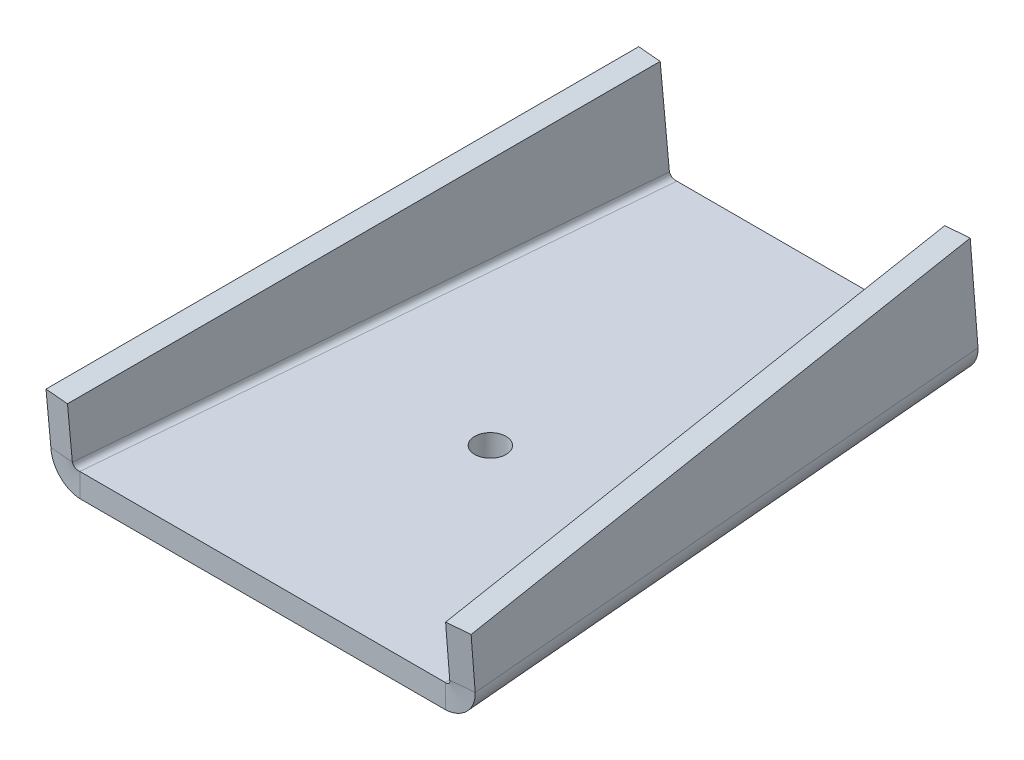
ISO-10303-21;
HEADER;
FILE_DESCRIPTION(('STEP AP214'),'2;1');
FILE_NAME('part.step','',(''),(''),'','','');
FILE_SCHEMA(('AUTOMOTIVE_DESIGN { 1 0 10303 214 1 1 1 1 }'));
ENDSEC;
DATA;
#1=APPLICATION_CONTEXT('core data for automotive mechanical design processes');
#2=APPLICATION_PROTOCOL_DEFINITION('international standard','automotive_design',2000,#1);
#3=PRODUCT_CONTEXT('',#1,'mechanical');
#4=PRODUCT('Part','Part','',(#3));
#5=PRODUCT_RELATED_PRODUCT_CATEGORY('part','',(#4));
#6=PRODUCT_DEFINITION_FORMATION('','',#4);
#7=PRODUCT_DEFINITION_CONTEXT('part definition',#1,'design');
#8=PRODUCT_DEFINITION('design','',#6,#7);
#9=PRODUCT_DEFINITION_SHAPE('','',#8);
#10=(LENGTH_UNIT() NAMED_UNIT(*) SI_UNIT(.MILLI.,.METRE.));
#11=(NAMED_UNIT(*) PLANE_ANGLE_UNIT() SI_UNIT($,.RADIAN.));
#12=(NAMED_UNIT(*) SI_UNIT($,.STERADIAN.) SOLID_ANGLE_UNIT());
#13=UNCERTAINTY_MEASURE_WITH_UNIT(LENGTH_MEASURE(1.E-05),#10,'distance_accuracy_value','');
#14=(GEOMETRIC_REPRESENTATION_CONTEXT(3) GLOBAL_UNCERTAINTY_ASSIGNED_CONTEXT((#13)) GLOBAL_UNIT_ASSIGNED_CONTEXT((#10,
#11,#12)) REPRESENTATION_CONTEXT('',''));
#15=CARTESIAN_POINT('',(0.,0.,0.));
#16=DIRECTION('',(0.,0.,1.));
#17=DIRECTION('',(1.,0.,0.));
#18=AXIS2_PLACEMENT_3D('',#15,#16,#17);
#19=CARTESIAN_POINT('',(0.,0.,0.));
#20=DIRECTION('',(0.,-1.,0.));
#21=DIRECTION('',(0.,0.,-1.));
#22=AXIS2_PLACEMENT_3D('',#19,#20,#21);
#23=PLANE('',#22);
#24=CARTESIAN_POINT('',(0.,0.,5.99999999999999));
#25=DIRECTION('',(0.,1.,0.));
#26=DIRECTION('',(0.,0.,1.));
#27=AXIS2_PLACEMENT_3D('',#24,#25,#26);
#28=CIRCLE('',#27,2.);
#29=CARTESIAN_POINT('',(0.,0.,7.99999999999999));
#30=VERTEX_POINT('',#29);
#31=EDGE_CURVE('E823',#30,#30,#28,.T.);
#32=ORIENTED_EDGE('',*,*,#31,.F.);
#33=EDGE_LOOP('',(#32));
#34=FACE_BOUND('',#33,.T.);
#35=DIRECTION('',(1.,0.,0.));
#36=VECTOR('',#35,1.);
#37=CARTESIAN_POINT('',(-33.,0.,35.));
#38=LINE('',#37,#36);
#39=CARTESIAN_POINT('',(-23.2606990742545,0.,35.));
#40=VERTEX_POINT('',#39);
#41=CARTESIAN_POINT('',(23.2606990742545,0.,35.));
#42=VERTEX_POINT('',#41);
#43=EDGE_CURVE('E94',#40,#42,#38,.T.);
#44=ORIENTED_EDGE('',*,*,#43,.T.);
#45=DIRECTION('',(-0.0854011413464359,0.,-0.996346649041751));
#46=VECTOR('',#45,1.);
#47=CARTESIAN_POINT('',(20.1129306045071,0.,-1.72396548038632));
#48=LINE('',#47,#46);
#49=CARTESIAN_POINT('',(17.2606990742545,0.,-35.));
#50=VERTEX_POINT('',#49);
#51=EDGE_CURVE('E87',#42,#50,#48,.T.);
#52=ORIENTED_EDGE('',*,*,#51,.T.);
#53=DIRECTION('',(-1.,0.,0.));
#54=VECTOR('',#53,1.);
#55=CARTESIAN_POINT('',(-33.,0.,-35.));
#56=LINE('',#55,#54);
#57=CARTESIAN_POINT('',(-17.2606990742545,0.,-35.));
#58=VERTEX_POINT('',#57);
#59=EDGE_CURVE('E102',#50,#58,#56,.T.);
#60=ORIENTED_EDGE('',*,*,#59,.T.);
#61=DIRECTION('',(0.0854011413464358,0.,-0.996346649041751));
#62=VECTOR('',#61,1.);
#63=CARTESIAN_POINT('',(-20.1129306045071,0.,-1.72396548038632));
#64=LINE('',#63,#62);
#65=EDGE_CURVE('E454',#40,#58,#64,.T.);
#66=ORIENTED_EDGE('',*,*,#65,.F.);
#67=EDGE_LOOP('',(#44,#52,#60,#66));
#68=FACE_BOUND('',#67,.T.);
#69=ADVANCED_FACE('F77',(#34,#68),#23,.F.);
#70=CARTESIAN_POINT('',(0.,-3.,0.));
#71=DIRECTION('',(0.,-1.,0.));
#72=DIRECTION('',(0.,0.,-1.));
#73=AXIS2_PLACEMENT_3D('',#70,#71,#72);
#74=PLANE('',#73);
#75=CARTESIAN_POINT('',(0.,-3.,5.99999999999999));
#76=DIRECTION('',(0.,-1.,0.));
#77=DIRECTION('',(0.,0.,-1.));
#78=AXIS2_PLACEMENT_3D('',#75,#76,#77);
#79=CIRCLE('',#78,2.);
#80=CARTESIAN_POINT('',(0.,-3.,3.99999999999999));
#81=VERTEX_POINT('',#80);
#82=EDGE_CURVE('E82',#81,#81,#79,.T.);
#83=ORIENTED_EDGE('',*,*,#82,.F.);
#84=EDGE_LOOP('',(#83));
#85=FACE_BOUND('',#84,.T.);
#86=DIRECTION('',(-0.0854011413464359,0.,-0.996346649041751));
#87=VECTOR('',#86,1.);
#88=CARTESIAN_POINT('',(20.1129306045071,-3.,-1.72396548038632));
#89=LINE('',#88,#87);
#90=CARTESIAN_POINT('',(23.2606990742545,-3.,35.));
#91=VERTEX_POINT('',#90);
#92=CARTESIAN_POINT('',(17.2606990742545,-3.,-35.));
#93=VERTEX_POINT('',#92);
#94=EDGE_CURVE('E890',#91,#93,#89,.T.);
#95=ORIENTED_EDGE('',*,*,#94,.F.);
#96=DIRECTION('',(1.,0.,0.));
#97=VECTOR('',#96,1.);
#98=CARTESIAN_POINT('',(-33.,-3.,35.));
#99=LINE('',#98,#97);
#100=CARTESIAN_POINT('',(-23.2606990742545,-3.,35.));
#101=VERTEX_POINT('',#100);
#102=EDGE_CURVE('E625',#101,#91,#99,.T.);
#103=ORIENTED_EDGE('',*,*,#102,.F.);
#104=DIRECTION('',(0.0854011413464358,0.,-0.996346649041751));
#105=VECTOR('',#104,1.);
#106=CARTESIAN_POINT('',(-20.1129306045071,-3.,-1.72396548038632));
#107=LINE('',#106,#105);
#108=CARTESIAN_POINT('',(-17.2606990742545,-3.,-35.));
#109=VERTEX_POINT('',#108);
#110=EDGE_CURVE('E619',#101,#109,#107,.T.);
#111=ORIENTED_EDGE('',*,*,#110,.T.);
#112=DIRECTION('',(-1.,0.,0.));
#113=VECTOR('',#112,1.);
#114=CARTESIAN_POINT('',(-33.,-3.,-35.));
#115=LINE('',#114,#113);
#116=EDGE_CURVE('E479',#93,#109,#115,.T.);
#117=ORIENTED_EDGE('',*,*,#116,.F.);
#118=EDGE_LOOP('',(#95,#103,#111,#117));
#119=FACE_BOUND('',#118,.T.);
#120=ADVANCED_FACE('F411',(#85,#119),#74,.T.);
#121=CARTESIAN_POINT('',(-33.,-3.,-35.));
#122=DIRECTION('',(0.,0.,-1.));
#123=DIRECTION('',(-1.,0.,0.));
#124=AXIS2_PLACEMENT_3D('',#121,#122,#123);
#125=PLANE('',#124);
#126=CARTESIAN_POINT('',(17.2606990742545,-3.,-35.));
#127=CARTESIAN_POINT('',(17.2606990742545,0.,-35.));
#128=B_SPLINE_CURVE_WITH_KNOTS('',1,(#126,#127),.UNSPECIFIED.,.F.,.F.,(2,2),(0.,1.),.UNSPECIFIED.);
#129=EDGE_CURVE('E308',#93,#50,#128,.T.);
#130=ORIENTED_EDGE('',*,*,#129,.F.);
#131=ORIENTED_EDGE('',*,*,#116,.T.);
#132=CARTESIAN_POINT('',(-17.2606990742545,0.,-35.));
#133=CARTESIAN_POINT('',(-17.2606990742545,-3.,-35.));
#134=B_SPLINE_CURVE_WITH_KNOTS('',1,(#132,#133),.UNSPECIFIED.,.F.,.F.,(2,2),(0.,1.),.UNSPECIFIED.);
#135=EDGE_CURVE('E450',#109,#58,#134,.F.);
#136=ORIENTED_EDGE('',*,*,#135,.T.);
#137=ORIENTED_EDGE('',*,*,#59,.F.);
#138=EDGE_LOOP('',(#130,#131,#136,#137));
#139=FACE_BOUND('',#138,.T.);
#140=ADVANCED_FACE('F528',(#139),#125,.T.);
#141=CARTESIAN_POINT('',(-33.,-3.,35.));
#142=DIRECTION('',(0.,0.,1.));
#143=DIRECTION('',(1.,0.,0.));
#144=AXIS2_PLACEMENT_3D('',#141,#142,#143);
#145=PLANE('',#144);
#146=CARTESIAN_POINT('',(23.2606990742545,0.,35.0000000000001));
#147=CARTESIAN_POINT('',(23.2606990742545,-3.,35.));
#148=B_SPLINE_CURVE_WITH_KNOTS('',1,(#146,#147),.UNSPECIFIED.,.F.,.F.,(2,2),(0.,1.),.UNSPECIFIED.);
#149=EDGE_CURVE('E12',#42,#91,#148,.T.);
#150=ORIENTED_EDGE('',*,*,#149,.F.);
#151=ORIENTED_EDGE('',*,*,#43,.F.);
#152=CARTESIAN_POINT('',(-23.2606990742545,-3.,35.));
#153=CARTESIAN_POINT('',(-23.2606990742545,0.,35.));
#154=B_SPLINE_CURVE_WITH_KNOTS('',1,(#152,#153),.UNSPECIFIED.,.F.,.F.,(2,2),(0.,1.),.UNSPECIFIED.);
#155=EDGE_CURVE('E437',#40,#101,#154,.F.);
#156=ORIENTED_EDGE('',*,*,#155,.T.);
#157=ORIENTED_EDGE('',*,*,#102,.T.);
#158=EDGE_LOOP('',(#150,#151,#156,#157));
#159=FACE_BOUND('',#158,.T.);
#160=ADVANCED_FACE('F79',(#159),#145,.T.);
#161=CARTESIAN_POINT('',(-23.2606990742545,-3.,35.));
#162=CARTESIAN_POINT('',(-23.7499499944457,-3.,34.9795752216678));
#163=CARTESIAN_POINT('',(-24.2388331183929,-2.90274630363883,34.9591742282255));
#164=CARTESIAN_POINT('',(-25.1429668954393,-2.52839021872452,34.9246913364874));
#165=CARTESIAN_POINT('',(-25.5577752247937,-2.25143512330504,34.9106434814043));
#166=CARTESIAN_POINT('',(-26.2506280277805,-1.55971527385827,34.8942703874428));
#167=CARTESIAN_POINT('',(-26.5284013334941,-1.14522268205391,34.8919683915288));
#168=CARTESIAN_POINT('',(-26.9050498131617,-0.241447144696889,34.9026985252804));
#169=CARTESIAN_POINT('',(-27.0037779027792,0.247392185745543,34.9157393919235));
#170=CARTESIAN_POINT('',(-27.005608256553,0.736599999999999,34.9370935192842));
#171=CARTESIAN_POINT('',(-23.2606990742545,0.,35.));
#172=CARTESIAN_POINT('',(-23.3586143746017,0.,35.0131180997183));
#173=CARTESIAN_POINT('',(-23.4564582359675,0.0191717263661178,35.0262349324334));
#174=CARTESIAN_POINT('',(-23.6376296449802,0.0929689463382528,35.0537202436696));
#175=CARTESIAN_POINT('',(-23.7208705294139,0.147565403889501,35.068092455294));
#176=CARTESIAN_POINT('',(-23.8603918914608,0.283924886066478,35.0991477705559));
#177=CARTESIAN_POINT('',(-23.916618913449,0.365634259058795,35.1158354561041));
#178=CARTESIAN_POINT('',(-23.9938065751916,0.543796508380954,35.1522336599635));
#179=CARTESIAN_POINT('',(-24.0147379705513,0.640162719297398,35.1719429897649));
#180=CARTESIAN_POINT('',(-24.0165683094277,0.7366,35.1932969433235));
#181=B_SPLINE_SURFACE_WITH_KNOTS('',1,3,((#161,#162,#163,#164,#165,#166,#167,#168,#169,#170),
(#171,#172,#173,#174,#175,#176,#177,#178,#179,#180)),.UNSPECIFIED.,.F.,.F.,.F.,(2,2),(4,2,2,2,
4),(0.,1.),(0.,0.25,0.5,0.75,1.),.UNSPECIFIED.);
#182=CARTESIAN_POINT('',(-23.2606990742545,0.,35.));
#183=CARTESIAN_POINT('',(-23.3586143746017,0.,35.0131180997183));
#184=CARTESIAN_POINT('',(-23.4564582359675,0.0191717263661178,35.0262349324334));
#185=CARTESIAN_POINT('',(-23.6376296449802,0.0929689463382528,35.0537202436696));
#186=CARTESIAN_POINT('',(-23.7208705294139,0.147565403889501,35.068092455294));
#187=CARTESIAN_POINT('',(-23.8603918914608,0.283924886066478,35.0991477705559));
#188=CARTESIAN_POINT('',(-23.916618913449,0.365634259058795,35.1158354561041));
#189=CARTESIAN_POINT('',(-23.9938065751916,0.543796508380954,35.1522336599635));
#190=CARTESIAN_POINT('',(-24.0147379705513,0.640162719297398,35.1719429897649));
#191=CARTESIAN_POINT('',(-24.0165683094277,0.7366,35.1932969433235));
#192=B_SPLINE_CURVE_WITH_KNOTS('',3,(#182,#183,#184,#185,#186,#187,#188,#189,#190,#191),
.UNSPECIFIED.,.F.,.F.,(4,2,2,2,4),(0.,0.25,0.5,0.75,1.),.UNSPECIFIED.);
#193=CARTESIAN_POINT('',(-24.0165683094277,0.7366,35.1932969433235));
#194=VERTEX_POINT('',#193);
#195=EDGE_CURVE('E320',#40,#194,#192,.T.);
#196=CARTESIAN_POINT('',(-24.0165683094277,0.7366,35.1932969433235));
#197=CARTESIAN_POINT('',(-27.005608256553,0.736599999999999,34.9370935192842));
#198=B_SPLINE_CURVE_WITH_KNOTS('',1,(#196,#197),.UNSPECIFIED.,.F.,.F.,(2,2),(0.,1.),.UNSPECIFIED.);
#199=CARTESIAN_POINT('',(-27.005608256553,0.736600000000014,34.9370935192842));
#200=VERTEX_POINT('',#199);
#201=EDGE_CURVE('E332',#194,#200,#198,.T.);
#202=CARTESIAN_POINT('',(-27.005608256553,0.736599999999999,34.9370935192842));
#203=CARTESIAN_POINT('',(-27.0037779027792,0.247392185745543,34.9157393919235));
#204=CARTESIAN_POINT('',(-26.9050498131617,-0.241447144696889,34.9026985252804));
#205=CARTESIAN_POINT('',(-26.5284013334941,-1.14522268205391,34.8919683915288));
#206=CARTESIAN_POINT('',(-26.2506280277805,-1.55971527385827,34.8942703874428));
#207=CARTESIAN_POINT('',(-25.5577752247937,-2.25143512330504,34.9106434814043));
#208=CARTESIAN_POINT('',(-25.1429668954393,-2.52839021872452,34.9246913364874));
#209=CARTESIAN_POINT('',(-24.2388331183929,-2.90274630363883,34.9591742282255));
#210=CARTESIAN_POINT('',(-23.7499499944457,-3.,34.9795752216678));
#211=CARTESIAN_POINT('',(-23.2606990742545,-3.,35.));
#212=B_SPLINE_CURVE_WITH_KNOTS('',3,(#202,#203,#204,#205,#206,#207,#208,#209,#210,#211),
.UNSPECIFIED.,.F.,.F.,(4,2,2,2,4),(0.,0.25,0.5,0.75,1.),.UNSPECIFIED.);
#213=EDGE_CURVE('E375',#101,#200,#212,.F.);
#214=ORIENTED_EDGE('',*,*,#155,.F.);
#215=ORIENTED_EDGE('',*,*,#195,.T.);
#216=ORIENTED_EDGE('',*,*,#201,.T.);
#217=ORIENTED_EDGE('',*,*,#213,.F.);
#218=EDGE_LOOP('',(#214,#215,#216,#217));
#219=FACE_BOUND('',#218,.T.);
#220=ADVANCED_FACE('F397',(#219),#181,.T.);
#221=CARTESIAN_POINT('',(-21.005608256553,0.736599999999999,-35.0629064807158));
#222=CARTESIAN_POINT('',(-21.0037779027792,0.247392185745544,-35.0842606080765));
#223=CARTESIAN_POINT('',(-20.9050498131618,-0.241447144696889,-35.0973014747196));
#224=CARTESIAN_POINT('',(-20.5284013334941,-1.14522268205391,-35.1080316084712));
#225=CARTESIAN_POINT('',(-20.2506280277805,-1.55971527385827,-35.1057296125572));
#226=CARTESIAN_POINT('',(-19.5577752247937,-2.25143512330504,-35.0893565185957));
#227=CARTESIAN_POINT('',(-19.1429668954393,-2.52839021872452,-35.0753086635126));
#228=CARTESIAN_POINT('',(-18.2388331183929,-2.90274630363883,-35.0408257717745));
#229=CARTESIAN_POINT('',(-17.7499499944457,-3.,-35.0204247783323));
#230=CARTESIAN_POINT('',(-17.2606990742545,-3.,-35.));
#231=CARTESIAN_POINT('',(-18.0165683094277,0.7366,-34.8067030566765));
#232=CARTESIAN_POINT('',(-18.0147379705513,0.640162719297402,-34.8280570102352));
#233=CARTESIAN_POINT('',(-17.9938065751916,0.543796508380953,-34.8477663400365));
#234=CARTESIAN_POINT('',(-17.916618913449,0.365634259058794,-34.8841645438959));
#235=CARTESIAN_POINT('',(-17.8603918914608,0.283924886066477,-34.9008522294442));
#236=CARTESIAN_POINT('',(-17.7208705294139,0.1475654038895,-34.931907544706));
#237=CARTESIAN_POINT('',(-17.6376296449802,0.0929689463382522,-34.9462797563304));
#238=CARTESIAN_POINT('',(-17.4564582359675,0.0191717263661176,-34.9737650675667));
#239=CARTESIAN_POINT('',(-17.3586143746017,0.,-34.9868819002818));
#240=CARTESIAN_POINT('',(-17.2606990742545,0.,-35.));
#241=B_SPLINE_SURFACE_WITH_KNOTS('',1,3,((#221,#222,#223,#224,#225,#226,#227,#228,#229,#230),
(#231,#232,#233,#234,#235,#236,#237,#238,#239,#240)),.UNSPECIFIED.,.F.,.F.,.F.,(2,2),(4,2,2,2,
4),(0.,1.),(0.,0.25,0.5,0.75,1.),.UNSPECIFIED.);
#242=CARTESIAN_POINT('',(-21.005608256553,0.736599999999999,-35.0629064807158));
#243=CARTESIAN_POINT('',(-18.0165683094277,0.7366,-34.8067030566765));
#244=B_SPLINE_CURVE_WITH_KNOTS('',1,(#242,#243),.UNSPECIFIED.,.F.,.F.,(2,2),(0.,1.),.UNSPECIFIED.);
#245=CARTESIAN_POINT('',(-21.005608256553,0.736600000000018,-35.0629064807158));
#246=VERTEX_POINT('',#245);
#247=CARTESIAN_POINT('',(-18.0165683094277,0.736599999999997,-34.8067030566765));
#248=VERTEX_POINT('',#247);
#249=EDGE_CURVE('E488',#246,#248,#244,.T.);
#250=CARTESIAN_POINT('',(-18.0165683094277,0.7366,-34.8067030566765));
#251=CARTESIAN_POINT('',(-18.0147379705513,0.640162719297402,-34.8280570102352));
#252=CARTESIAN_POINT('',(-17.9938065751916,0.543796508380953,-34.8477663400365));
#253=CARTESIAN_POINT('',(-17.916618913449,0.365634259058794,-34.8841645438959));
#254=CARTESIAN_POINT('',(-17.8603918914608,0.283924886066477,-34.9008522294442));
#255=CARTESIAN_POINT('',(-17.7208705294139,0.1475654038895,-34.931907544706));
#256=CARTESIAN_POINT('',(-17.6376296449802,0.0929689463382522,-34.9462797563304));
#257=CARTESIAN_POINT('',(-17.4564582359675,0.0191717263661176,-34.9737650675667));
#258=CARTESIAN_POINT('',(-17.3586143746017,0.,-34.9868819002818));
#259=CARTESIAN_POINT('',(-17.2606990742545,0.,-35.));
#260=B_SPLINE_CURVE_WITH_KNOTS('',3,(#250,#251,#252,#253,#254,#255,#256,#257,#258,#259),
.UNSPECIFIED.,.F.,.F.,(4,2,2,2,4),(0.,0.25,0.5,0.75,1.),.UNSPECIFIED.);
#261=EDGE_CURVE('E615',#248,#58,#260,.T.);
#262=CARTESIAN_POINT('',(-17.2606990742545,-3.,-35.));
#263=CARTESIAN_POINT('',(-17.7499499944457,-3.,-35.0204247783323));
#264=CARTESIAN_POINT('',(-18.2388331183929,-2.90274630363883,-35.0408257717745));
#265=CARTESIAN_POINT('',(-19.1429668954393,-2.52839021872452,-35.0753086635126));
#266=CARTESIAN_POINT('',(-19.5577752247937,-2.25143512330504,-35.0893565185957));
#267=CARTESIAN_POINT('',(-20.2506280277805,-1.55971527385827,-35.1057296125572));
#268=CARTESIAN_POINT('',(-20.5284013334941,-1.14522268205391,-35.1080316084712));
#269=CARTESIAN_POINT('',(-20.9050498131618,-0.241447144696889,-35.0973014747196));
#270=CARTESIAN_POINT('',(-21.0037779027792,0.247392185745544,-35.0842606080765));
#271=CARTESIAN_POINT('',(-21.005608256553,0.736599999999999,-35.0629064807158));
#272=B_SPLINE_CURVE_WITH_KNOTS('',3,(#262,#263,#264,#265,#266,#267,#268,#269,#270,#271),
.UNSPECIFIED.,.F.,.F.,(4,2,2,2,4),(0.,0.25,0.5,0.75,1.),.UNSPECIFIED.);
#273=EDGE_CURVE('E465',#246,#109,#272,.F.);
#274=ORIENTED_EDGE('',*,*,#249,.T.);
#275=ORIENTED_EDGE('',*,*,#261,.T.);
#276=ORIENTED_EDGE('',*,*,#135,.F.);
#277=ORIENTED_EDGE('',*,*,#273,.F.);
#278=EDGE_LOOP('',(#274,#275,#276,#277));
#279=FACE_BOUND('',#278,.T.);
#280=ADVANCED_FACE('F350',(#279),#241,.T.);
#281=CARTESIAN_POINT('',(-26.2935496579618,0.7366,70.383256809919));
#282=DIRECTION('',(0.0854011413464358,0.,-0.996346649041751));
#283=DIRECTION('',(-0.996346649041751,0.,-0.0854011413464358));
#284=AXIS2_PLACEMENT_3D('',#281,#282,#283);
#285=CYLINDRICAL_SURFACE('',#284,3.7366);
#286=ORIENTED_EDGE('',*,*,#273,.T.);
#287=ORIENTED_EDGE('',*,*,#110,.F.);
#288=ORIENTED_EDGE('',*,*,#213,.T.);
#289=DIRECTION('',(0.0854011413464358,0.,-0.996346649041751));
#290=VECTOR('',#289,1.);
#291=CARTESIAN_POINT('',(-23.8358794933165,0.736600000000007,-2.04307538514142));
#292=LINE('',#291,#290);
#293=EDGE_CURVE('E486',#200,#246,#292,.T.);
#294=ORIENTED_EDGE('',*,*,#293,.T.);
#295=EDGE_LOOP('',(#286,#287,#288,#294));
#296=FACE_BOUND('',#295,.T.);
#297=ADVANCED_FACE('F339',(#296),#285,.T.);
#298=CARTESIAN_POINT('',(-26.2935496579618,0.7366,70.383256809919));
#299=DIRECTION('',(0.0854011413464358,0.,-0.996346649041751));
#300=DIRECTION('',(-0.996346649041751,0.,-0.0854011413464358));
#301=AXIS2_PLACEMENT_3D('',#298,#299,#300);
#302=CYLINDRICAL_SURFACE('',#301,0.7366);
#303=ORIENTED_EDGE('',*,*,#261,.F.);
#304=DIRECTION('',(0.0854011413464358,0.,-0.996346649041751));
#305=VECTOR('',#304,1.);
#306=CARTESIAN_POINT('',(-20.8468395461912,0.736599999999997,-1.78687196110211));
#307=LINE('',#306,#305);
#308=EDGE_CURVE('E504',#194,#248,#307,.T.);
#309=ORIENTED_EDGE('',*,*,#308,.F.);
#310=ORIENTED_EDGE('',*,*,#195,.F.);
#311=ORIENTED_EDGE('',*,*,#65,.T.);
#312=EDGE_LOOP('',(#303,#309,#310,#311));
#313=FACE_BOUND('',#312,.T.);
#314=ADVANCED_FACE('F349',(#313),#302,.F.);
#315=CARTESIAN_POINT('',(-27.0546801416147,7.44031984137577,35.5095988450045));
#316=DIRECTION('',(-0.00729335494327044,0.996346649041751,0.0850891410048625));
#317=DIRECTION('',(-0.0850891410048625,-0.0854011413464358,0.992706645056726));
#318=AXIS2_PLACEMENT_3D('',#315,#316,#317);
#319=PLANE('',#318);
#320=DIRECTION('',(-0.0850891410048625,-0.0854011413464358,0.992706645056726));
#321=VECTOR('',#320,1.);
#322=CARTESIAN_POINT('',(-24.0656401944894,7.44031984137575,35.7658022690438));
#323=LINE('',#322,#321);
#324=CARTESIAN_POINT('',(-18.1094003241491,13.4183997356263,-33.7236628849271));
#325=VERTEX_POINT('',#324);
#326=CARTESIAN_POINT('',(-24.0656401944894,7.44031984137575,35.7658022690438));
#327=VERTEX_POINT('',#326);
#328=EDGE_CURVE('E322',#325,#327,#323,.T.);
#329=ORIENTED_EDGE('',*,*,#328,.F.);
#330=DIRECTION('',(0.996346649041751,0.,0.0854011413464358));
#331=VECTOR('',#330,1.);
#332=CARTESIAN_POINT('',(-21.0984402712743,13.4183997356263,-33.9798663089664));
#333=LINE('',#332,#331);
#334=CARTESIAN_POINT('',(-21.0984402712743,13.4183997356263,-33.9798663089664));
#335=VERTEX_POINT('',#334);
#336=EDGE_CURVE('E312',#335,#325,#333,.T.);
#337=ORIENTED_EDGE('',*,*,#336,.F.);
#338=DIRECTION('',(-0.0850891410048625,-0.0854011413464358,0.992706645056726));
#339=VECTOR('',#338,1.);
#340=CARTESIAN_POINT('',(-27.0546801416147,7.44031984137577,35.5095988450045));
#341=LINE('',#340,#339);
#342=CARTESIAN_POINT('',(-27.0546801416147,7.44031984137577,35.5095988450045));
#343=VERTEX_POINT('',#342);
#344=EDGE_CURVE('E329',#335,#343,#341,.T.);
#345=ORIENTED_EDGE('',*,*,#344,.T.);
#346=DIRECTION('',(0.996346649041751,0.,0.0854011413464358));
#347=VECTOR('',#346,1.);
#348=CARTESIAN_POINT('',(-27.0546801416147,7.44031984137577,35.5095988450045));
#349=LINE('',#348,#347);
#350=EDGE_CURVE('E326',#343,#327,#349,.T.);
#351=ORIENTED_EDGE('',*,*,#350,.T.);
#352=EDGE_LOOP('',(#329,#337,#345,#351));
#353=FACE_BOUND('',#352,.T.);
#354=ADVANCED_FACE('F283',(#353),#319,.T.);
#355=CARTESIAN_POINT('',(-23.8358794933166,-22.4500796298768,-2.04307538514142));
#356=DIRECTION('',(-0.996346649041751,0.,-0.0854011413464358));
#357=DIRECTION('',(0.0850891410048625,0.0854011413464358,-0.992706645056726));
#358=AXIS2_PLACEMENT_3D('',#355,#356,#357);
#359=PLANE('',#358);
#360=ORIENTED_EDGE('',*,*,#293,.F.);
#361=DIRECTION('',(0.00729335494327044,-0.996346649041751,-0.0850891410048625));
#362=VECTOR('',#361,1.);
#363=CARTESIAN_POINT('',(-27.0546801416147,7.44031984137577,35.5095988450045));
#364=LINE('',#363,#362);
#365=EDGE_CURVE('E328',#343,#200,#364,.T.);
#366=ORIENTED_EDGE('',*,*,#365,.F.);
#367=ORIENTED_EDGE('',*,*,#344,.F.);
#368=DIRECTION('',(-0.00729335494327045,0.996346649041751,0.0850891410048626));
#369=VECTOR('',#368,1.);
#370=CARTESIAN_POINT('',(-21.0984402712743,13.4183997356263,-33.9798663089664));
#371=LINE('',#370,#369);
#372=EDGE_CURVE('E321',#246,#335,#371,.T.);
#373=ORIENTED_EDGE('',*,*,#372,.F.);
#374=EDGE_LOOP('',(#360,#366,#367,#373));
#375=FACE_BOUND('',#374,.T.);
#376=ADVANCED_FACE('F515',(#375),#359,.T.);
#377=CARTESIAN_POINT('',(-27.0546801416147,7.44031984137577,35.5095988450045));
#378=DIRECTION('',(-0.0850891410048625,-0.0854011413464358,0.992706645056726));
#379=DIRECTION('',(0.00729335494327044,-0.996346649041751,-0.0850891410048625));
#380=AXIS2_PLACEMENT_3D('',#377,#378,#379);
#381=PLANE('',#380);
#382=ORIENTED_EDGE('',*,*,#201,.F.);
#383=DIRECTION('',(0.00729335494327044,-0.996346649041751,-0.0850891410048625));
#384=VECTOR('',#383,1.);
#385=CARTESIAN_POINT('',(-24.0656401944894,7.44031984137575,35.7658022690438));
#386=LINE('',#385,#384);
#387=EDGE_CURVE('E493',#327,#194,#386,.T.);
#388=ORIENTED_EDGE('',*,*,#387,.F.);
#389=ORIENTED_EDGE('',*,*,#350,.F.);
#390=ORIENTED_EDGE('',*,*,#365,.T.);
#391=EDGE_LOOP('',(#382,#388,#389,#390));
#392=FACE_BOUND('',#391,.T.);
#393=ADVANCED_FACE('F506',(#392),#381,.T.);
#394=CARTESIAN_POINT('',(-20.8468395461913,-22.4500796298768,-1.78687196110212));
#395=DIRECTION('',(-0.996346649041751,0.,-0.0854011413464358));
#396=DIRECTION('',(0.0850891410048625,0.0854011413464358,-0.992706645056726));
#397=AXIS2_PLACEMENT_3D('',#394,#395,#396);
#398=PLANE('',#397);
#399=ORIENTED_EDGE('',*,*,#387,.T.);
#400=ORIENTED_EDGE('',*,*,#308,.T.);
#401=DIRECTION('',(-0.00729335494327045,0.996346649041751,0.0850891410048626));
#402=VECTOR('',#401,1.);
#403=CARTESIAN_POINT('',(-18.1094003241491,13.4183997356263,-33.7236628849271));
#404=LINE('',#403,#402);
#405=EDGE_CURVE('E325',#248,#325,#404,.T.);
#406=ORIENTED_EDGE('',*,*,#405,.T.);
#407=ORIENTED_EDGE('',*,*,#328,.T.);
#408=EDGE_LOOP('',(#399,#400,#406,#407));
#409=FACE_BOUND('',#408,.T.);
#410=ADVANCED_FACE('F514',(#409),#398,.F.);
#411=CARTESIAN_POINT('',(-21.0984402712743,13.4183997356263,-33.9798663089664));
#412=DIRECTION('',(0.0850891410048625,0.0854011413464359,-0.992706645056726));
#413=DIRECTION('',(-0.00729335494327045,0.996346649041751,0.0850891410048626));
#414=AXIS2_PLACEMENT_3D('',#411,#412,#413);
#415=PLANE('',#414);
#416=ORIENTED_EDGE('',*,*,#249,.F.);
#417=ORIENTED_EDGE('',*,*,#372,.T.);
#418=ORIENTED_EDGE('',*,*,#336,.T.);
#419=ORIENTED_EDGE('',*,*,#405,.F.);
#420=EDGE_LOOP('',(#416,#417,#418,#419));
#421=FACE_BOUND('',#420,.T.);
#422=ADVANCED_FACE('F352',(#421),#415,.T.);
#423=CARTESIAN_POINT('',(27.005608256553,0.736599999999999,34.9370935192842));
#424=CARTESIAN_POINT('',(27.0037779027792,0.247392185745544,34.9157393919235));
#425=CARTESIAN_POINT('',(26.9050498131617,-0.241447144696889,34.9026985252804));
#426=CARTESIAN_POINT('',(26.5284013334941,-1.14522268205391,34.8919683915289));
#427=CARTESIAN_POINT('',(26.2506280277805,-1.55971527385827,34.8942703874428));
#428=CARTESIAN_POINT('',(25.5577752247937,-2.25143512330504,34.9106434814043));
#429=CARTESIAN_POINT('',(25.1429668954393,-2.52839021872452,34.9246913364875));
#430=CARTESIAN_POINT('',(24.2388331183929,-2.90274630363883,34.9591742282255));
#431=CARTESIAN_POINT('',(23.7499499944457,-3.,34.9795752216678));
#432=CARTESIAN_POINT('',(23.2606990742545,-3.,35.));
#433=CARTESIAN_POINT('',(24.0165683094277,0.7366,35.1932969433235));
#434=CARTESIAN_POINT('',(24.0147379705513,0.640162719297405,35.1719429897649));
#435=CARTESIAN_POINT('',(23.9938065751917,0.543796508380954,35.1522336599636));
#436=CARTESIAN_POINT('',(23.916618913449,0.365634259058796,35.1158354561042));
#437=CARTESIAN_POINT('',(23.8603918914608,0.283924886066479,35.0991477705559));
#438=CARTESIAN_POINT('',(23.7208705294139,0.147565403889502,35.068092455294));
#439=CARTESIAN_POINT('',(23.6376296449802,0.092968946338254,35.0537202436697));
#440=CARTESIAN_POINT('',(23.4564582359675,0.0191717263661184,35.0262349324334));
#441=CARTESIAN_POINT('',(23.3586143746017,0.,35.0131180997183));
#442=CARTESIAN_POINT('',(23.2606990742545,0.,35.0000000000001));
#443=B_SPLINE_SURFACE_WITH_KNOTS('',1,3,((#423,#424,#425,#426,#427,#428,#429,#430,#431,#432),
(#433,#434,#435,#436,#437,#438,#439,#440,#441,#442)),.UNSPECIFIED.,.F.,.F.,.F.,(2,2),(4,2,2,2,
4),(0.,1.),(0.,0.25,0.5,0.75,1.),.UNSPECIFIED.);
#444=CARTESIAN_POINT('',(27.005608256553,0.736599999999999,34.9370935192842));
#445=CARTESIAN_POINT('',(24.0165683094277,0.7366,35.1932969433235));
#446=B_SPLINE_CURVE_WITH_KNOTS('',1,(#444,#445),.UNSPECIFIED.,.F.,.F.,(2,2),(0.,1.),.UNSPECIFIED.);
#447=CARTESIAN_POINT('',(24.0165683094277,0.736600000000004,35.1932969433235));
#448=VERTEX_POINT('',#447);
#449=CARTESIAN_POINT('',(27.005608256553,0.73659999999999,34.9370935192842));
#450=VERTEX_POINT('',#449);
#451=EDGE_CURVE('E177',#448,#450,#446,.F.);
#452=CARTESIAN_POINT('',(24.0165683094277,0.7366,35.1932969433235));
#453=CARTESIAN_POINT('',(24.0147379705513,0.640162719297405,35.1719429897649));
#454=CARTESIAN_POINT('',(23.9938065751917,0.543796508380954,35.1522336599636));
#455=CARTESIAN_POINT('',(23.916618913449,0.365634259058796,35.1158354561042));
#456=CARTESIAN_POINT('',(23.8603918914608,0.283924886066479,35.0991477705559));
#457=CARTESIAN_POINT('',(23.7208705294139,0.147565403889502,35.068092455294));
#458=CARTESIAN_POINT('',(23.6376296449802,0.092968946338254,35.0537202436697));
#459=CARTESIAN_POINT('',(23.4564582359675,0.0191717263661184,35.0262349324334));
#460=CARTESIAN_POINT('',(23.3586143746017,0.,35.0131180997183));
#461=CARTESIAN_POINT('',(23.2606990742545,0.,35.0000000000001));
#462=B_SPLINE_CURVE_WITH_KNOTS('',3,(#452,#453,#454,#455,#456,#457,#458,#459,#460,#461),
.UNSPECIFIED.,.F.,.F.,(4,2,2,2,4),(0.,0.25,0.5,0.75,1.),.UNSPECIFIED.);
#463=EDGE_CURVE('E189',#448,#42,#462,.T.);
#464=CARTESIAN_POINT('',(23.2606990742545,-3.,35.));
#465=CARTESIAN_POINT('',(23.7499499944457,-3.,34.9795752216678));
#466=CARTESIAN_POINT('',(24.2388331183929,-2.90274630363883,34.9591742282255));
#467=CARTESIAN_POINT('',(25.1429668954393,-2.52839021872452,34.9246913364875));
#468=CARTESIAN_POINT('',(25.5577752247937,-2.25143512330504,34.9106434814043));
#469=CARTESIAN_POINT('',(26.2506280277805,-1.55971527385827,34.8942703874428));
#470=CARTESIAN_POINT('',(26.5284013334941,-1.14522268205391,34.8919683915289));
#471=CARTESIAN_POINT('',(26.9050498131617,-0.241447144696889,34.9026985252804));
#472=CARTESIAN_POINT('',(27.0037779027792,0.247392185745544,34.9157393919235));
#473=CARTESIAN_POINT('',(27.005608256553,0.736599999999999,34.9370935192842));
#474=B_SPLINE_CURVE_WITH_KNOTS('',3,(#464,#465,#466,#467,#468,#469,#470,#471,#472,#473),
.UNSPECIFIED.,.F.,.F.,(4,2,2,2,4),(0.,0.25,0.5,0.75,1.),.UNSPECIFIED.);
#475=EDGE_CURVE('E589',#450,#91,#474,.F.);
#476=ORIENTED_EDGE('',*,*,#451,.F.);
#477=ORIENTED_EDGE('',*,*,#463,.T.);
#478=ORIENTED_EDGE('',*,*,#149,.T.);
#479=ORIENTED_EDGE('',*,*,#475,.F.);
#480=EDGE_LOOP('',(#476,#477,#478,#479));
#481=FACE_BOUND('',#480,.T.);
#482=ADVANCED_FACE('F279',(#481),#443,.T.);
#483=CARTESIAN_POINT('',(17.2606990742545,-3.,-35.));
#484=CARTESIAN_POINT('',(17.7499499944457,-3.,-35.0204247783322));
#485=CARTESIAN_POINT('',(18.2388331183929,-2.90274630363883,-35.0408257717745));
#486=CARTESIAN_POINT('',(19.1429668954393,-2.52839021872452,-35.0753086635126));
#487=CARTESIAN_POINT('',(19.5577752247937,-2.25143512330504,-35.0893565185957));
#488=CARTESIAN_POINT('',(20.2506280277805,-1.55971527385827,-35.1057296125572));
#489=CARTESIAN_POINT('',(20.5284013334941,-1.14522268205391,-35.1080316084711));
#490=CARTESIAN_POINT('',(20.9050498131617,-0.241447144696889,-35.0973014747196));
#491=CARTESIAN_POINT('',(21.0037779027792,0.247392185745545,-35.0842606080765));
#492=CARTESIAN_POINT('',(21.005608256553,0.736599999999999,-35.0629064807158));
#493=CARTESIAN_POINT('',(17.2606990742545,0.,-35.));
#494=CARTESIAN_POINT('',(17.3586143746017,0.,-34.9868819002817));
#495=CARTESIAN_POINT('',(17.4564582359675,0.0191717263661181,-34.9737650675666));
#496=CARTESIAN_POINT('',(17.6376296449802,0.0929689463382534,-34.9462797563303));
#497=CARTESIAN_POINT('',(17.7208705294139,0.147565403889501,-34.931907544706));
#498=CARTESIAN_POINT('',(17.8603918914608,0.283924886066479,-34.9008522294441));
#499=CARTESIAN_POINT('',(17.916618913449,0.365634259058795,-34.8841645438958));
#500=CARTESIAN_POINT('',(17.9938065751916,0.543796508380954,-34.8477663400364));
#501=CARTESIAN_POINT('',(18.0147379705513,0.640162719297398,-34.8280570102351));
#502=CARTESIAN_POINT('',(18.0165683094277,0.7366,-34.8067030566765));
#503=B_SPLINE_SURFACE_WITH_KNOTS('',1,3,((#483,#484,#485,#486,#487,#488,#489,#490,#491,#492),
(#493,#494,#495,#496,#497,#498,#499,#500,#501,#502)),.UNSPECIFIED.,.F.,.F.,.F.,(2,2),(4,2,2,2,
4),(0.,1.),(0.,0.25,0.5,0.75,1.),.UNSPECIFIED.);
#504=CARTESIAN_POINT('',(17.2606990742545,0.,-35.));
#505=CARTESIAN_POINT('',(17.3586143746017,0.,-34.9868819002817));
#506=CARTESIAN_POINT('',(17.4564582359675,0.0191717263661181,-34.9737650675666));
#507=CARTESIAN_POINT('',(17.6376296449802,0.0929689463382534,-34.9462797563303));
#508=CARTESIAN_POINT('',(17.7208705294139,0.147565403889501,-34.931907544706));
#509=CARTESIAN_POINT('',(17.8603918914608,0.283924886066479,-34.9008522294441));
#510=CARTESIAN_POINT('',(17.916618913449,0.365634259058795,-34.8841645438958));
#511=CARTESIAN_POINT('',(17.9938065751916,0.543796508380954,-34.8477663400364));
#512=CARTESIAN_POINT('',(18.0147379705513,0.640162719297398,-34.8280570102351));
#513=CARTESIAN_POINT('',(18.0165683094277,0.7366,-34.8067030566765));
#514=B_SPLINE_CURVE_WITH_KNOTS('',3,(#504,#505,#506,#507,#508,#509,#510,#511,#512,#513),
.UNSPECIFIED.,.F.,.F.,(4,2,2,2,4),(0.,0.25,0.5,0.75,1.),.UNSPECIFIED.);
#515=CARTESIAN_POINT('',(18.0165683094277,0.736600000000014,-34.8067030566765));
#516=VERTEX_POINT('',#515);
#517=EDGE_CURVE('E251',#50,#516,#514,.T.);
#518=CARTESIAN_POINT('',(18.0165683094277,0.7366,-34.8067030566765));
#519=CARTESIAN_POINT('',(21.005608256553,0.736599999999999,-35.0629064807158));
#520=B_SPLINE_CURVE_WITH_KNOTS('',1,(#518,#519),.UNSPECIFIED.,.F.,.F.,(2,2),(0.,1.),.UNSPECIFIED.);
#521=CARTESIAN_POINT('',(21.005608256553,0.736600000000025,-35.0629064807158));
#522=VERTEX_POINT('',#521);
#523=EDGE_CURVE('E554',#522,#516,#520,.F.);
#524=CARTESIAN_POINT('',(21.005608256553,0.736599999999999,-35.0629064807158));
#525=CARTESIAN_POINT('',(21.0037779027792,0.247392185745545,-35.0842606080765));
#526=CARTESIAN_POINT('',(20.9050498131617,-0.241447144696889,-35.0973014747196));
#527=CARTESIAN_POINT('',(20.5284013334941,-1.14522268205391,-35.1080316084711));
#528=CARTESIAN_POINT('',(20.2506280277805,-1.55971527385827,-35.1057296125572));
#529=CARTESIAN_POINT('',(19.5577752247937,-2.25143512330504,-35.0893565185957));
#530=CARTESIAN_POINT('',(19.1429668954393,-2.52839021872452,-35.0753086635126));
#531=CARTESIAN_POINT('',(18.2388331183929,-2.90274630363883,-35.0408257717745));
#532=CARTESIAN_POINT('',(17.7499499944457,-3.,-35.0204247783322));
#533=CARTESIAN_POINT('',(17.2606990742545,-3.,-35.));
#534=B_SPLINE_CURVE_WITH_KNOTS('',3,(#524,#525,#526,#527,#528,#529,#530,#531,#532,#533),
.UNSPECIFIED.,.F.,.F.,(4,2,2,2,4),(0.,0.25,0.5,0.75,1.),.UNSPECIFIED.);
#535=EDGE_CURVE('E245',#93,#522,#534,.F.);
#536=ORIENTED_EDGE('',*,*,#517,.T.);
#537=ORIENTED_EDGE('',*,*,#523,.F.);
#538=ORIENTED_EDGE('',*,*,#535,.F.);
#539=ORIENTED_EDGE('',*,*,#129,.T.);
#540=EDGE_LOOP('',(#536,#537,#538,#539));
#541=FACE_BOUND('',#540,.T.);
#542=ADVANCED_FACE('F221',(#541),#503,.T.);
#543=CARTESIAN_POINT('',(14.2278484905471,0.7366,-70.383256809919));
#544=DIRECTION('',(0.0854011413464359,0.,0.996346649041751));
#545=DIRECTION('',(0.996346649041751,0.,-0.0854011413464359));
#546=AXIS2_PLACEMENT_3D('',#543,#544,#545);
#547=CYLINDRICAL_SURFACE('',#546,3.7366);
#548=ORIENTED_EDGE('',*,*,#94,.T.);
#549=ORIENTED_EDGE('',*,*,#535,.T.);
#550=DIRECTION('',(-0.0854011413464359,0.,-0.996346649041751));
#551=VECTOR('',#550,1.);
#552=CARTESIAN_POINT('',(23.8358794933165,0.736600000000018,-2.04307538514142));
#553=LINE('',#552,#551);
#554=EDGE_CURVE('E198',#450,#522,#553,.T.);
#555=ORIENTED_EDGE('',*,*,#554,.F.);
#556=ORIENTED_EDGE('',*,*,#475,.T.);
#557=EDGE_LOOP('',(#548,#549,#555,#556));
#558=FACE_BOUND('',#557,.T.);
#559=ADVANCED_FACE('F210',(#558),#547,.T.);
#560=CARTESIAN_POINT('',(14.2278484905471,0.7366,-70.383256809919));
#561=DIRECTION('',(0.0854011413464359,0.,0.996346649041751));
#562=DIRECTION('',(0.996346649041751,0.,-0.0854011413464359));
#563=AXIS2_PLACEMENT_3D('',#560,#561,#562);
#564=CYLINDRICAL_SURFACE('',#563,0.7366);
#565=ORIENTED_EDGE('',*,*,#51,.F.);
#566=ORIENTED_EDGE('',*,*,#463,.F.);
#567=DIRECTION('',(-0.0854011413464359,0.,-0.996346649041751));
#568=VECTOR('',#567,1.);
#569=CARTESIAN_POINT('',(20.8468395461912,0.736600000000007,-1.78687196110211));
#570=LINE('',#569,#568);
#571=EDGE_CURVE('E196',#448,#516,#570,.T.);
#572=ORIENTED_EDGE('',*,*,#571,.T.);
#573=ORIENTED_EDGE('',*,*,#517,.F.);
#574=EDGE_LOOP('',(#565,#566,#572,#573));
#575=FACE_BOUND('',#574,.T.);
#576=ADVANCED_FACE('F220',(#575),#564,.F.);
#577=CARTESIAN_POINT('',(27.0546801416147,7.4403198413758,35.5095988450045));
#578=DIRECTION('',(0.00729335494327045,0.996346649041751,0.0850891410048625));
#579=DIRECTION('',(-0.0850891410048626,0.0854011413464358,-0.992706645056726));
#580=AXIS2_PLACEMENT_3D('',#577,#578,#579);
#581=PLANE('',#580);
#582=DIRECTION('',(-0.0850891410048626,0.0854011413464358,-0.992706645056726));
#583=VECTOR('',#582,1.);
#584=CARTESIAN_POINT('',(24.0656401944894,7.44031984137579,35.7658022690438));
#585=LINE('',#584,#583);
#586=CARTESIAN_POINT('',(24.0656401944894,7.44031984137579,35.7658022690438));
#587=VERTEX_POINT('',#586);
#588=CARTESIAN_POINT('',(18.109400324149,13.4183997356263,-33.7236628849271));
#589=VERTEX_POINT('',#588);
#590=EDGE_CURVE('E188',#587,#589,#585,.T.);
#591=ORIENTED_EDGE('',*,*,#590,.F.);
#592=DIRECTION('',(-0.996346649041751,0.,0.0854011413464359));
#593=VECTOR('',#592,1.);
#594=CARTESIAN_POINT('',(27.0546801416147,7.4403198413758,35.5095988450045));
#595=LINE('',#594,#593);
#596=CARTESIAN_POINT('',(27.0546801416147,7.4403198413758,35.5095988450045));
#597=VERTEX_POINT('',#596);
#598=EDGE_CURVE('E174',#597,#587,#595,.T.);
#599=ORIENTED_EDGE('',*,*,#598,.F.);
#600=DIRECTION('',(-0.0850891410048626,0.0854011413464358,-0.992706645056726));
#601=VECTOR('',#600,1.);
#602=CARTESIAN_POINT('',(27.0546801416147,7.4403198413758,35.5095988450045));
#603=LINE('',#602,#601);
#604=CARTESIAN_POINT('',(21.0984402712743,13.4183997356263,-33.9798663089664));
#605=VERTEX_POINT('',#604);
#606=EDGE_CURVE('E186',#597,#605,#603,.T.);
#607=ORIENTED_EDGE('',*,*,#606,.T.);
#608=DIRECTION('',(-0.996346649041751,0.,0.0854011413464359));
#609=VECTOR('',#608,1.);
#610=CARTESIAN_POINT('',(21.0984402712743,13.4183997356263,-33.9798663089664));
#611=LINE('',#610,#609);
#612=EDGE_CURVE('E195',#605,#589,#611,.T.);
#613=ORIENTED_EDGE('',*,*,#612,.T.);
#614=EDGE_LOOP('',(#591,#599,#607,#613));
#615=FACE_BOUND('',#614,.T.);
#616=ADVANCED_FACE('F185',(#615),#581,.T.);
#617=CARTESIAN_POINT('',(23.8358794933166,-22.4500796298767,-2.04307538514143));
#618=DIRECTION('',(0.996346649041751,0.,-0.0854011413464359));
#619=DIRECTION('',(-0.0850891410048626,0.0854011413464359,-0.992706645056726));
#620=AXIS2_PLACEMENT_3D('',#617,#618,#619);
#621=PLANE('',#620);
#622=DIRECTION('',(0.00729335494327045,0.996346649041751,0.0850891410048626));
#623=VECTOR('',#622,1.);
#624=CARTESIAN_POINT('',(26.5733187153588,-58.3185589953798,29.8937155386835));
#625=LINE('',#624,#623);
#626=EDGE_CURVE('E171',#450,#597,#625,.T.);
#627=ORIENTED_EDGE('',*,*,#626,.F.);
#628=ORIENTED_EDGE('',*,*,#554,.T.);
#629=DIRECTION('',(-0.00729335494327045,-0.996346649041751,-0.0850891410048625));
#630=VECTOR('',#629,1.);
#631=CARTESIAN_POINT('',(20.6170788450184,-52.3404791011293,-39.5957496152873));
#632=LINE('',#631,#630);
#633=EDGE_CURVE('E194',#605,#522,#632,.T.);
#634=ORIENTED_EDGE('',*,*,#633,.F.);
#635=ORIENTED_EDGE('',*,*,#606,.F.);
#636=EDGE_LOOP('',(#627,#628,#634,#635));
#637=FACE_BOUND('',#636,.T.);
#638=ADVANCED_FACE('F192',(#637),#621,.T.);
#639=CARTESIAN_POINT('',(20.6170788450184,-52.3404791011293,-39.5957496152873));
#640=DIRECTION('',(-0.0850891410048626,0.0854011413464358,-0.992706645056726));
#641=DIRECTION('',(-0.00729335494327045,-0.996346649041751,-0.0850891410048625));
#642=AXIS2_PLACEMENT_3D('',#639,#640,#641);
#643=PLANE('',#642);
#644=ORIENTED_EDGE('',*,*,#633,.T.);
#645=ORIENTED_EDGE('',*,*,#523,.T.);
#646=DIRECTION('',(-0.00729335494327045,-0.996346649041751,-0.0850891410048625));
#647=VECTOR('',#646,1.);
#648=CARTESIAN_POINT('',(17.6280388978932,-52.3404791011293,-39.339546191248));
#649=LINE('',#648,#647);
#650=EDGE_CURVE('E583',#589,#516,#649,.T.);
#651=ORIENTED_EDGE('',*,*,#650,.F.);
#652=ORIENTED_EDGE('',*,*,#612,.F.);
#653=EDGE_LOOP('',(#644,#645,#651,#652));
#654=FACE_BOUND('',#653,.T.);
#655=ADVANCED_FACE('F565',(#654),#643,.T.);
#656=CARTESIAN_POINT('',(20.8468395461913,-22.4500796298767,-1.78687196110212));
#657=DIRECTION('',(0.996346649041751,0.,-0.0854011413464359));
#658=DIRECTION('',(-0.0850891410048626,0.0854011413464359,-0.992706645056726));
#659=AXIS2_PLACEMENT_3D('',#656,#657,#658);
#660=PLANE('',#659);
#661=ORIENTED_EDGE('',*,*,#571,.F.);
#662=DIRECTION('',(0.00729335494327045,0.996346649041751,0.0850891410048626));
#663=VECTOR('',#662,1.);
#664=CARTESIAN_POINT('',(23.5842787682336,-58.3185589953798,30.1499189627228));
#665=LINE('',#664,#663);
#666=EDGE_CURVE('E582',#448,#587,#665,.T.);
#667=ORIENTED_EDGE('',*,*,#666,.T.);
#668=ORIENTED_EDGE('',*,*,#590,.T.);
#669=ORIENTED_EDGE('',*,*,#650,.T.);
#670=EDGE_LOOP('',(#661,#667,#668,#669));
#671=FACE_BOUND('',#670,.T.);
#672=ADVANCED_FACE('F574',(#671),#660,.F.);
#673=CARTESIAN_POINT('',(26.5733187153588,-58.3185589953798,29.8937155386835));
#674=DIRECTION('',(0.0850891410048626,-0.0854011413464359,0.992706645056726));
#675=DIRECTION('',(0.00729335494327045,0.996346649041751,0.0850891410048626));
#676=AXIS2_PLACEMENT_3D('',#673,#674,#675);
#677=PLANE('',#676);
#678=ORIENTED_EDGE('',*,*,#666,.F.);
#679=ORIENTED_EDGE('',*,*,#451,.T.);
#680=ORIENTED_EDGE('',*,*,#626,.T.);
#681=ORIENTED_EDGE('',*,*,#598,.T.);
#682=EDGE_LOOP('',(#678,#679,#680,#681));
#683=FACE_BOUND('',#682,.T.);
#684=ADVANCED_FACE('F173',(#683),#677,.T.);
#685=CARTESIAN_POINT('',(0.,-3.007525,5.99999999999999));
#686=DIRECTION('',(0.,1.,0.));
#687=DIRECTION('',(0.,0.,1.));
#688=AXIS2_PLACEMENT_3D('',#685,#686,#687);
#689=CYLINDRICAL_SURFACE('',#688,2.);
#690=ORIENTED_EDGE('',*,*,#82,.T.);
#691=EDGE_LOOP('',(#690));
#692=FACE_BOUND('',#691,.T.);
#693=ORIENTED_EDGE('',*,*,#31,.T.);
#694=EDGE_LOOP('',(#693));
#695=FACE_BOUND('',#694,.T.);
#696=ADVANCED_FACE('F580',(#692,#695),#689,.F.);
#697=CLOSED_SHELL('',(#69,#120,#140,#160,#220,#280,#297,#314,#354,#376,#393,#410,#422,#482,#542,
#559,#576,#616,#638,#655,#672,#684,#696));
#698=MANIFOLD_SOLID_BREP('B2',#697);
#699=ADVANCED_BREP_SHAPE_REPRESENTATION('',(#18,#698),#14);
#700=SHAPE_DEFINITION_REPRESENTATION(#9,#699);
ENDSEC;
END-ISO-10303-21;
